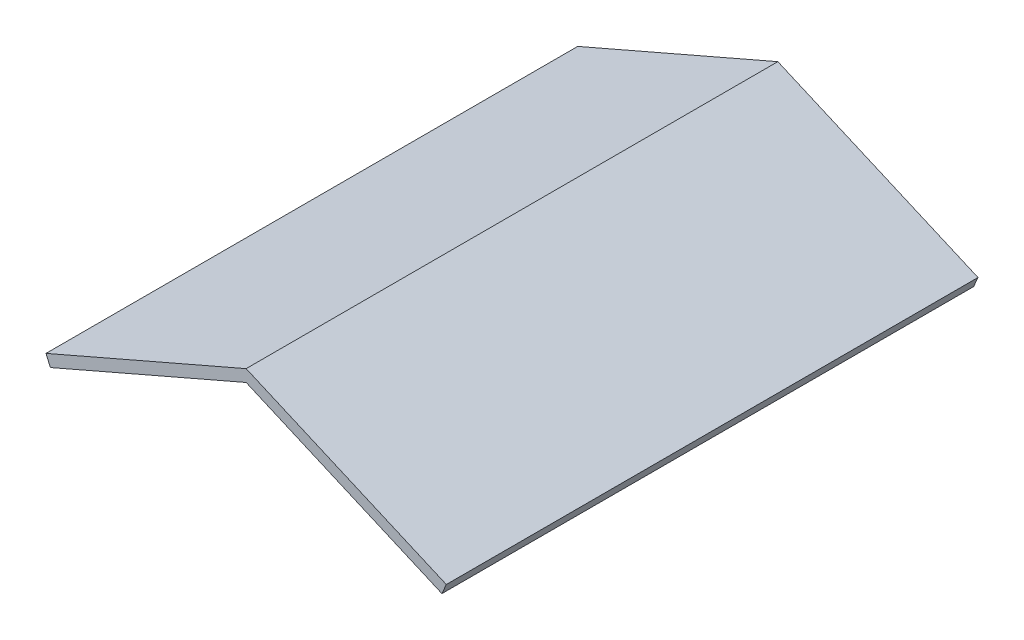
ISO-10303-21;
HEADER;
FILE_DESCRIPTION(('STEP AP214'),'2;1');
FILE_NAME('part.step','',(''),(''),'','','');
FILE_SCHEMA(('AUTOMOTIVE_DESIGN { 1 0 10303 214 1 1 1 1 }'));
ENDSEC;
DATA;
#1=APPLICATION_CONTEXT('core data for automotive mechanical design processes');
#2=APPLICATION_PROTOCOL_DEFINITION('international standard','automotive_design',2000,#1);
#3=PRODUCT_CONTEXT('',#1,'mechanical');
#4=PRODUCT('Part','Part','',(#3));
#5=PRODUCT_RELATED_PRODUCT_CATEGORY('part','',(#4));
#6=PRODUCT_DEFINITION_FORMATION('','',#4);
#7=PRODUCT_DEFINITION_CONTEXT('part definition',#1,'design');
#8=PRODUCT_DEFINITION('design','',#6,#7);
#9=PRODUCT_DEFINITION_SHAPE('','',#8);
#10=(LENGTH_UNIT() NAMED_UNIT(*) SI_UNIT(.MILLI.,.METRE.));
#11=(NAMED_UNIT(*) PLANE_ANGLE_UNIT() SI_UNIT($,.RADIAN.));
#12=(NAMED_UNIT(*) SI_UNIT($,.STERADIAN.) SOLID_ANGLE_UNIT());
#13=UNCERTAINTY_MEASURE_WITH_UNIT(LENGTH_MEASURE(1.E-05),#10,'distance_accuracy_value','');
#14=(GEOMETRIC_REPRESENTATION_CONTEXT(3) GLOBAL_UNCERTAINTY_ASSIGNED_CONTEXT((#13)) GLOBAL_UNIT_ASSIGNED_CONTEXT((#10,
#11,#12)) REPRESENTATION_CONTEXT('',''));
#15=CARTESIAN_POINT('',(0.,0.,0.));
#16=DIRECTION('',(0.,0.,1.));
#17=DIRECTION('',(1.,0.,0.));
#18=AXIS2_PLACEMENT_3D('',#15,#16,#17);
#19=CARTESIAN_POINT('',(-4838.87078880957,5100.,14000.));
#20=DIRECTION('',(0.398111093569329,0.917337210177933,0.));
#21=DIRECTION('',(-0.917337210177933,0.398111093569329,0.));
#22=AXIS2_PLACEMENT_3D('',#19,#20,#21);
#23=PLANE('',#22);
#24=DIRECTION('',(0.,0.,-1.));
#25=VECTOR('',#24,1.);
#26=CARTESIAN_POINT('',(-4838.87078880957,5100.,14000.));
#27=LINE('',#26,#25);
#28=CARTESIAN_POINT('',(-4838.87078880957,5100.,14000.));
#29=VERTEX_POINT('',#28);
#30=CARTESIAN_POINT('',(-4838.87078880957,5100.,-500.));
#31=VERTEX_POINT('',#30);
#32=EDGE_CURVE('E109',#29,#31,#27,.T.);
#33=ORIENTED_EDGE('',*,*,#32,.T.);
#34=DIRECTION('',(0.917337210177933,-0.398111093569329,0.));
#35=VECTOR('',#34,1.);
#36=CARTESIAN_POINT('',(-4838.87078880957,5100.,-500.));
#37=LINE('',#36,#35);
#38=CARTESIAN_POINT('',(500.,2783.00722506824,-500.));
#39=VERTEX_POINT('',#38);
#40=EDGE_CURVE('E103',#31,#39,#37,.T.);
#41=ORIENTED_EDGE('',*,*,#40,.T.);
#42=DIRECTION('',(0.,0.,-1.));
#43=VECTOR('',#42,1.);
#44=CARTESIAN_POINT('',(500.,2783.00722506824,14000.));
#45=LINE('',#44,#43);
#46=CARTESIAN_POINT('',(500.,2783.00722506824,14000.));
#47=VERTEX_POINT('',#46);
#48=EDGE_CURVE('E11',#47,#39,#45,.T.);
#49=ORIENTED_EDGE('',*,*,#48,.F.);
#50=DIRECTION('',(0.917337210177933,-0.398111093569329,0.));
#51=VECTOR('',#50,1.);
#52=CARTESIAN_POINT('',(-4838.87078880957,5100.,14000.));
#53=LINE('',#52,#51);
#54=EDGE_CURVE('E121',#29,#47,#53,.T.);
#55=ORIENTED_EDGE('',*,*,#54,.F.);
#56=EDGE_LOOP('',(#33,#41,#49,#55));
#57=FACE_BOUND('',#56,.T.);
#58=ADVANCED_FACE('F39',(#57),#23,.F.);
#59=CARTESIAN_POINT('',(500.,2783.00722506824,14000.));
#60=DIRECTION('',(-0.917337210177934,0.398111093569325,0.));
#61=DIRECTION('',(-0.398111093569325,-0.917337210177934,0.));
#62=AXIS2_PLACEMENT_3D('',#59,#60,#61);
#63=PLANE('',#62);
#64=ORIENTED_EDGE('',*,*,#48,.T.);
#65=DIRECTION('',(0.398111093569325,0.917337210177934,0.));
#66=VECTOR('',#65,1.);
#67=CARTESIAN_POINT('',(500.,2783.00722506824,-500.));
#68=LINE('',#67,#66);
#69=CARTESIAN_POINT('',(619.433328070798,3058.20838812162,-500.));
#70=VERTEX_POINT('',#69);
#71=EDGE_CURVE('E93',#39,#70,#68,.T.);
#72=ORIENTED_EDGE('',*,*,#71,.T.);
#73=DIRECTION('',(0.,0.,-1.));
#74=VECTOR('',#73,1.);
#75=CARTESIAN_POINT('',(619.433328070798,3058.20838812162,14000.));
#76=LINE('',#75,#74);
#77=CARTESIAN_POINT('',(619.433328070798,3058.20838812162,14000.));
#78=VERTEX_POINT('',#77);
#79=EDGE_CURVE('E46',#78,#70,#76,.T.);
#80=ORIENTED_EDGE('',*,*,#79,.F.);
#81=DIRECTION('',(0.398111093569325,0.917337210177934,0.));
#82=VECTOR('',#81,1.);
#83=CARTESIAN_POINT('',(500.,2783.00722506824,14000.));
#84=LINE('',#83,#82);
#85=EDGE_CURVE('E94',#47,#78,#84,.T.);
#86=ORIENTED_EDGE('',*,*,#85,.F.);
#87=EDGE_LOOP('',(#64,#72,#80,#86));
#88=FACE_BOUND('',#87,.T.);
#89=ADVANCED_FACE('F91',(#88),#63,.F.);
#90=CARTESIAN_POINT('',(619.433328070798,3058.20838812162,14000.));
#91=DIRECTION('',(-0.398111093569329,-0.917337210177933,0.));
#92=DIRECTION('',(0.917337210177933,-0.398111093569329,0.));
#93=AXIS2_PLACEMENT_3D('',#90,#91,#92);
#94=PLANE('',#93);
#95=ORIENTED_EDGE('',*,*,#79,.T.);
#96=DIRECTION('',(-0.917337210177933,0.398111093569329,0.));
#97=VECTOR('',#96,1.);
#98=CARTESIAN_POINT('',(619.433328070798,3058.20838812162,-500.));
#99=LINE('',#98,#97);
#100=CARTESIAN_POINT('',(-4838.87078880957,5427.03350160821,-500.));
#101=VERTEX_POINT('',#100);
#102=EDGE_CURVE('E107',#70,#101,#99,.T.);
#103=ORIENTED_EDGE('',*,*,#102,.T.);
#104=DIRECTION('',(0.,0.,-1.));
#105=VECTOR('',#104,1.);
#106=CARTESIAN_POINT('',(-4838.87078880957,5427.03350160821,14000.));
#107=LINE('',#106,#105);
#108=CARTESIAN_POINT('',(-4838.87078880957,5427.03350160821,14000.));
#109=VERTEX_POINT('',#108);
#110=EDGE_CURVE('E135',#109,#101,#107,.T.);
#111=ORIENTED_EDGE('',*,*,#110,.F.);
#112=DIRECTION('',(-0.917337210177933,0.398111093569329,0.));
#113=VECTOR('',#112,1.);
#114=CARTESIAN_POINT('',(619.433328070798,3058.20838812162,14000.));
#115=LINE('',#114,#113);
#116=EDGE_CURVE('E124',#78,#109,#115,.T.);
#117=ORIENTED_EDGE('',*,*,#116,.F.);
#118=EDGE_LOOP('',(#95,#103,#111,#117));
#119=FACE_BOUND('',#118,.T.);
#120=ADVANCED_FACE('F138',(#119),#94,.F.);
#121=CARTESIAN_POINT('',(-4838.87078880957,5427.03350160821,14000.));
#122=DIRECTION('',(0.398111093569329,-0.917337210177933,0.));
#123=DIRECTION('',(0.917337210177933,0.398111093569329,0.));
#124=AXIS2_PLACEMENT_3D('',#121,#122,#123);
#125=PLANE('',#124);
#126=ORIENTED_EDGE('',*,*,#110,.T.);
#127=DIRECTION('',(-0.917337210177933,-0.398111093569329,0.));
#128=VECTOR('',#127,1.);
#129=CARTESIAN_POINT('',(-4838.87078880957,5427.03350160821,-500.));
#130=LINE('',#129,#128);
#131=CARTESIAN_POINT('',(-10297.1749056899,3058.20838812162,-500.));
#132=VERTEX_POINT('',#131);
#133=EDGE_CURVE('E113',#101,#132,#130,.T.);
#134=ORIENTED_EDGE('',*,*,#133,.T.);
#135=DIRECTION('',(0.,0.,-1.));
#136=VECTOR('',#135,1.);
#137=CARTESIAN_POINT('',(-10297.1749056899,3058.20838812162,14000.));
#138=LINE('',#137,#136);
#139=CARTESIAN_POINT('',(-10297.1749056899,3058.20838812162,14000.));
#140=VERTEX_POINT('',#139);
#141=EDGE_CURVE('E133',#140,#132,#138,.T.);
#142=ORIENTED_EDGE('',*,*,#141,.F.);
#143=DIRECTION('',(-0.917337210177933,-0.398111093569329,0.));
#144=VECTOR('',#143,1.);
#145=CARTESIAN_POINT('',(-4838.87078880957,5427.03350160821,14000.));
#146=LINE('',#145,#144);
#147=EDGE_CURVE('E126',#109,#140,#146,.T.);
#148=ORIENTED_EDGE('',*,*,#147,.F.);
#149=EDGE_LOOP('',(#126,#134,#142,#148));
#150=FACE_BOUND('',#149,.T.);
#151=ADVANCED_FACE('F144',(#150),#125,.F.);
#152=CARTESIAN_POINT('',(-10297.1749056899,3058.20838812162,14000.));
#153=DIRECTION('',(0.917337210177934,0.398111093569327,0.));
#154=DIRECTION('',(-0.398111093569327,0.917337210177934,0.));
#155=AXIS2_PLACEMENT_3D('',#152,#153,#154);
#156=PLANE('',#155);
#157=ORIENTED_EDGE('',*,*,#141,.T.);
#158=DIRECTION('',(0.398111093569327,-0.917337210177934,0.));
#159=VECTOR('',#158,1.);
#160=CARTESIAN_POINT('',(-10297.1749056899,3058.20838812162,-500.));
#161=LINE('',#160,#159);
#162=CARTESIAN_POINT('',(-10177.7415776191,2783.00722506824,-500.));
#163=VERTEX_POINT('',#162);
#164=EDGE_CURVE('E116',#132,#163,#161,.T.);
#165=ORIENTED_EDGE('',*,*,#164,.T.);
#166=DIRECTION('',(0.,0.,-1.));
#167=VECTOR('',#166,1.);
#168=CARTESIAN_POINT('',(-10177.7415776191,2783.00722506824,14000.));
#169=LINE('',#168,#167);
#170=CARTESIAN_POINT('',(-10177.7415776191,2783.00722506824,14000.));
#171=VERTEX_POINT('',#170);
#172=EDGE_CURVE('E131',#171,#163,#169,.T.);
#173=ORIENTED_EDGE('',*,*,#172,.F.);
#174=DIRECTION('',(0.398111093569327,-0.917337210177934,0.));
#175=VECTOR('',#174,1.);
#176=CARTESIAN_POINT('',(-10297.1749056899,3058.20838812162,14000.));
#177=LINE('',#176,#175);
#178=EDGE_CURVE('E58',#140,#171,#177,.T.);
#179=ORIENTED_EDGE('',*,*,#178,.F.);
#180=EDGE_LOOP('',(#157,#165,#173,#179));
#181=FACE_BOUND('',#180,.T.);
#182=ADVANCED_FACE('F147',(#181),#156,.F.);
#183=CARTESIAN_POINT('',(-10177.7415776191,2783.00722506824,14000.));
#184=DIRECTION('',(-0.398111093569329,0.917337210177933,0.));
#185=DIRECTION('',(-0.917337210177933,-0.398111093569329,0.));
#186=AXIS2_PLACEMENT_3D('',#183,#184,#185);
#187=PLANE('',#186);
#188=ORIENTED_EDGE('',*,*,#172,.T.);
#189=DIRECTION('',(0.917337210177933,0.398111093569329,0.));
#190=VECTOR('',#189,1.);
#191=CARTESIAN_POINT('',(-10177.7415776191,2783.00722506824,-500.));
#192=LINE('',#191,#190);
#193=EDGE_CURVE('E119',#163,#31,#192,.T.);
#194=ORIENTED_EDGE('',*,*,#193,.T.);
#195=ORIENTED_EDGE('',*,*,#32,.F.);
#196=DIRECTION('',(0.917337210177933,0.398111093569329,0.));
#197=VECTOR('',#196,1.);
#198=CARTESIAN_POINT('',(-10177.7415776191,2783.00722506824,14000.));
#199=LINE('',#198,#197);
#200=EDGE_CURVE('E53',#171,#29,#199,.T.);
#201=ORIENTED_EDGE('',*,*,#200,.F.);
#202=EDGE_LOOP('',(#188,#194,#195,#201));
#203=FACE_BOUND('',#202,.T.);
#204=ADVANCED_FACE('F149',(#203),#187,.F.);
#205=CARTESIAN_POINT('',(0.,0.,14000.));
#206=DIRECTION('',(0.,0.,1.));
#207=DIRECTION('',(1.,0.,0.));
#208=AXIS2_PLACEMENT_3D('',#205,#206,#207);
#209=PLANE('',#208);
#210=ORIENTED_EDGE('',*,*,#54,.T.);
#211=ORIENTED_EDGE('',*,*,#85,.T.);
#212=ORIENTED_EDGE('',*,*,#116,.T.);
#213=ORIENTED_EDGE('',*,*,#147,.T.);
#214=ORIENTED_EDGE('',*,*,#178,.T.);
#215=ORIENTED_EDGE('',*,*,#200,.T.);
#216=EDGE_LOOP('',(#210,#211,#212,#213,#214,#215));
#217=FACE_BOUND('',#216,.T.);
#218=ADVANCED_FACE('F141',(#217),#209,.T.);
#219=CARTESIAN_POINT('',(0.,0.,-500.));
#220=DIRECTION('',(0.,0.,1.));
#221=DIRECTION('',(1.,0.,0.));
#222=AXIS2_PLACEMENT_3D('',#219,#220,#221);
#223=PLANE('',#222);
#224=ORIENTED_EDGE('',*,*,#40,.F.);
#225=ORIENTED_EDGE('',*,*,#193,.F.);
#226=ORIENTED_EDGE('',*,*,#164,.F.);
#227=ORIENTED_EDGE('',*,*,#133,.F.);
#228=ORIENTED_EDGE('',*,*,#102,.F.);
#229=ORIENTED_EDGE('',*,*,#71,.F.);
#230=EDGE_LOOP('',(#224,#225,#226,#227,#228,#229));
#231=FACE_BOUND('',#230,.T.);
#232=ADVANCED_FACE('F101',(#231),#223,.F.);
#233=CLOSED_SHELL('',(#58,#89,#120,#151,#182,#204,#218,#232));
#234=MANIFOLD_SOLID_BREP('B2',#233);
#235=ADVANCED_BREP_SHAPE_REPRESENTATION('',(#18,#234),#14);
#236=SHAPE_DEFINITION_REPRESENTATION(#9,#235);
ENDSEC;
END-ISO-10303-21;
